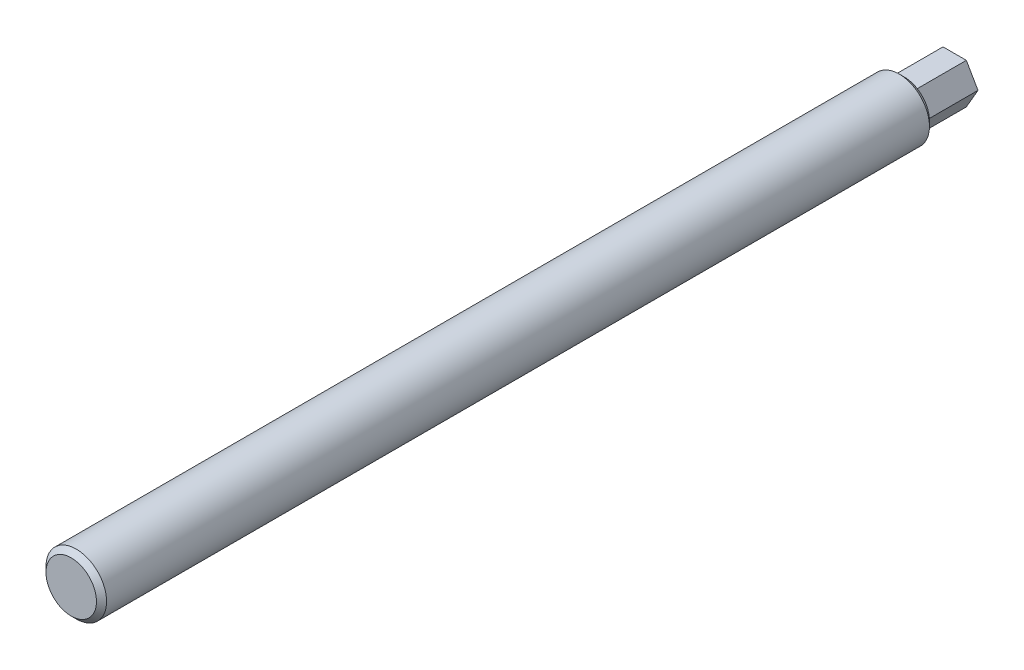
ISO-10303-21;
HEADER;
FILE_DESCRIPTION(('STEP AP214'),'2;1');
FILE_NAME('part.step','',(''),(''),'','','');
FILE_SCHEMA(('AUTOMOTIVE_DESIGN { 1 0 10303 214 1 1 1 1 }'));
ENDSEC;
DATA;
#1=APPLICATION_CONTEXT('core data for automotive mechanical design processes');
#2=APPLICATION_PROTOCOL_DEFINITION('international standard','automotive_design',2000,#1);
#3=PRODUCT_CONTEXT('',#1,'mechanical');
#4=PRODUCT('Part','Part','',(#3));
#5=PRODUCT_RELATED_PRODUCT_CATEGORY('part','',(#4));
#6=PRODUCT_DEFINITION_FORMATION('','',#4);
#7=PRODUCT_DEFINITION_CONTEXT('part definition',#1,'design');
#8=PRODUCT_DEFINITION('design','',#6,#7);
#9=PRODUCT_DEFINITION_SHAPE('','',#8);
#10=(LENGTH_UNIT() NAMED_UNIT(*) SI_UNIT(.MILLI.,.METRE.));
#11=(NAMED_UNIT(*) PLANE_ANGLE_UNIT() SI_UNIT($,.RADIAN.));
#12=(NAMED_UNIT(*) SI_UNIT($,.STERADIAN.) SOLID_ANGLE_UNIT());
#13=UNCERTAINTY_MEASURE_WITH_UNIT(LENGTH_MEASURE(1.E-05),#10,'distance_accuracy_value','');
#14=(GEOMETRIC_REPRESENTATION_CONTEXT(3) GLOBAL_UNCERTAINTY_ASSIGNED_CONTEXT((#13)) GLOBAL_UNIT_ASSIGNED_CONTEXT((#10,
#11,#12)) REPRESENTATION_CONTEXT('',''));
#15=CARTESIAN_POINT('',(0.,0.,0.));
#16=DIRECTION('',(0.,0.,1.));
#17=DIRECTION('',(1.,0.,0.));
#18=AXIS2_PLACEMENT_3D('',#15,#16,#17);
#19=CARTESIAN_POINT('',(0.,0.,-10.));
#20=DIRECTION('',(0.,0.,1.));
#21=DIRECTION('',(1.,0.,0.));
#22=AXIS2_PLACEMENT_3D('',#19,#20,#21);
#23=PLANE('',#22);
#24=DIRECTION('',(0.5,-0.866025403784438,0.));
#25=VECTOR('',#24,1.);
#26=CARTESIAN_POINT('',(-4.61880215351701,0.,-10.));
#27=LINE('',#26,#25);
#28=CARTESIAN_POINT('',(-4.61880215351701,0.,-10.));
#29=VERTEX_POINT('',#28);
#30=CARTESIAN_POINT('',(-2.3094010767585,-4.,-10.));
#31=VERTEX_POINT('',#30);
#32=EDGE_CURVE('E155',#29,#31,#27,.T.);
#33=ORIENTED_EDGE('',*,*,#32,.F.);
#34=DIRECTION('',(-0.5,-0.866025403784439,0.));
#35=VECTOR('',#34,1.);
#36=CARTESIAN_POINT('',(-2.3094010767585,4.,-10.));
#37=LINE('',#36,#35);
#38=CARTESIAN_POINT('',(-2.3094010767585,4.,-10.));
#39=VERTEX_POINT('',#38);
#40=EDGE_CURVE('E162',#39,#29,#37,.T.);
#41=ORIENTED_EDGE('',*,*,#40,.F.);
#42=DIRECTION('',(1.,0.,0.));
#43=VECTOR('',#42,1.);
#44=CARTESIAN_POINT('',(2.3094010767585,4.,-10.));
#45=LINE('',#44,#43);
#46=CARTESIAN_POINT('',(2.3094010767585,4.,-10.));
#47=VERTEX_POINT('',#46);
#48=EDGE_CURVE('E169',#47,#39,#45,.F.);
#49=ORIENTED_EDGE('',*,*,#48,.F.);
#50=DIRECTION('',(-0.5,0.866025403784439,0.));
#51=VECTOR('',#50,1.);
#52=CARTESIAN_POINT('',(4.618802153517,0.,-10.));
#53=LINE('',#52,#51);
#54=CARTESIAN_POINT('',(4.618802153517,0.,-10.));
#55=VERTEX_POINT('',#54);
#56=EDGE_CURVE('E81',#55,#47,#53,.T.);
#57=ORIENTED_EDGE('',*,*,#56,.F.);
#58=DIRECTION('',(0.5,0.866025403784439,0.));
#59=VECTOR('',#58,1.);
#60=CARTESIAN_POINT('',(2.3094010767585,-4.,-10.));
#61=LINE('',#60,#59);
#62=CARTESIAN_POINT('',(2.3094010767585,-4.,-10.));
#63=VERTEX_POINT('',#62);
#64=EDGE_CURVE('E84',#63,#55,#61,.T.);
#65=ORIENTED_EDGE('',*,*,#64,.F.);
#66=DIRECTION('',(1.,0.,0.));
#67=VECTOR('',#66,1.);
#68=CARTESIAN_POINT('',(-2.3094010767585,-4.,-10.));
#69=LINE('',#68,#67);
#70=EDGE_CURVE('E86',#31,#63,#69,.T.);
#71=ORIENTED_EDGE('',*,*,#70,.F.);
#72=EDGE_LOOP('',(#33,#41,#49,#57,#65,#71));
#73=FACE_BOUND('',#72,.T.);
#74=ADVANCED_FACE('F17',(#73),#23,.F.);
#75=CARTESIAN_POINT('',(-2.3094010767585,-4.,0.));
#76=DIRECTION('',(0.,-1.,0.));
#77=DIRECTION('',(0.,0.,-1.));
#78=AXIS2_PLACEMENT_3D('',#75,#76,#77);
#79=PLANE('',#78);
#80=DIRECTION('',(-1.,0.,0.));
#81=VECTOR('',#80,1.);
#82=CARTESIAN_POINT('',(0.,-4.,0.));
#83=LINE('',#82,#81);
#84=CARTESIAN_POINT('',(-2.3094010767585,-4.,0.));
#85=VERTEX_POINT('',#84);
#86=CARTESIAN_POINT('',(2.3094010767585,-4.,0.));
#87=VERTEX_POINT('',#86);
#88=EDGE_CURVE('E150',#85,#87,#83,.F.);
#89=ORIENTED_EDGE('',*,*,#88,.F.);
#90=DIRECTION('',(0.,0.,1.));
#91=VECTOR('',#90,1.);
#92=CARTESIAN_POINT('',(-2.3094010767585,-4.,0.));
#93=LINE('',#92,#91);
#94=EDGE_CURVE('E98',#31,#85,#93,.T.);
#95=ORIENTED_EDGE('',*,*,#94,.F.);
#96=ORIENTED_EDGE('',*,*,#70,.T.);
#97=DIRECTION('',(0.,0.,1.));
#98=VECTOR('',#97,1.);
#99=CARTESIAN_POINT('',(2.3094010767585,-4.,0.));
#100=LINE('',#99,#98);
#101=EDGE_CURVE('E92',#87,#63,#100,.F.);
#102=ORIENTED_EDGE('',*,*,#101,.F.);
#103=EDGE_LOOP('',(#89,#95,#96,#102));
#104=FACE_BOUND('',#103,.T.);
#105=ADVANCED_FACE('F95',(#104),#79,.T.);
#106=CARTESIAN_POINT('',(2.3094010767585,-4.,0.));
#107=DIRECTION('',(0.866025403784439,-0.5,0.));
#108=DIRECTION('',(0.5,0.866025403784439,0.));
#109=AXIS2_PLACEMENT_3D('',#106,#107,#108);
#110=PLANE('',#109);
#111=DIRECTION('',(0.5,0.866025403784439,0.));
#112=VECTOR('',#111,1.);
#113=CARTESIAN_POINT('',(2.3094010767585,-4.,0.));
#114=LINE('',#113,#112);
#115=CARTESIAN_POINT('',(4.618802153517,0.,0.));
#116=VERTEX_POINT('',#115);
#117=EDGE_CURVE('E104',#87,#116,#114,.T.);
#118=ORIENTED_EDGE('',*,*,#117,.F.);
#119=ORIENTED_EDGE('',*,*,#101,.T.);
#120=ORIENTED_EDGE('',*,*,#64,.T.);
#121=DIRECTION('',(0.,0.,1.));
#122=VECTOR('',#121,1.);
#123=CARTESIAN_POINT('',(4.618802153517,0.,0.));
#124=LINE('',#123,#122);
#125=EDGE_CURVE('E111',#116,#55,#124,.F.);
#126=ORIENTED_EDGE('',*,*,#125,.F.);
#127=EDGE_LOOP('',(#118,#119,#120,#126));
#128=FACE_BOUND('',#127,.T.);
#129=ADVANCED_FACE('F102',(#128),#110,.T.);
#130=CARTESIAN_POINT('',(4.618802153517,0.,0.));
#131=DIRECTION('',(0.866025403784439,0.5,0.));
#132=DIRECTION('',(-0.5,0.866025403784439,0.));
#133=AXIS2_PLACEMENT_3D('',#130,#131,#132);
#134=PLANE('',#133);
#135=DIRECTION('',(-0.5,0.866025403784439,0.));
#136=VECTOR('',#135,1.);
#137=CARTESIAN_POINT('',(4.618802153517,0.,0.));
#138=LINE('',#137,#136);
#139=CARTESIAN_POINT('',(2.3094010767585,4.,0.));
#140=VERTEX_POINT('',#139);
#141=EDGE_CURVE('E145',#116,#140,#138,.T.);
#142=ORIENTED_EDGE('',*,*,#141,.F.);
#143=ORIENTED_EDGE('',*,*,#125,.T.);
#144=ORIENTED_EDGE('',*,*,#56,.T.);
#145=DIRECTION('',(0.,0.,1.));
#146=VECTOR('',#145,1.);
#147=CARTESIAN_POINT('',(2.3094010767585,4.,0.));
#148=LINE('',#147,#146);
#149=EDGE_CURVE('E165',#140,#47,#148,.F.);
#150=ORIENTED_EDGE('',*,*,#149,.F.);
#151=EDGE_LOOP('',(#142,#143,#144,#150));
#152=FACE_BOUND('',#151,.T.);
#153=ADVANCED_FACE('F174',(#152),#134,.T.);
#154=CARTESIAN_POINT('',(2.3094010767585,4.,0.));
#155=DIRECTION('',(0.,1.,0.));
#156=DIRECTION('',(0.,0.,1.));
#157=AXIS2_PLACEMENT_3D('',#154,#155,#156);
#158=PLANE('',#157);
#159=DIRECTION('',(-1.,0.,0.));
#160=VECTOR('',#159,1.);
#161=CARTESIAN_POINT('',(0.,4.,0.));
#162=LINE('',#161,#160);
#163=CARTESIAN_POINT('',(-2.3094010767585,4.,0.));
#164=VERTEX_POINT('',#163);
#165=EDGE_CURVE('E137',#140,#164,#162,.T.);
#166=ORIENTED_EDGE('',*,*,#165,.F.);
#167=ORIENTED_EDGE('',*,*,#149,.T.);
#168=ORIENTED_EDGE('',*,*,#48,.T.);
#169=DIRECTION('',(0.,0.,1.));
#170=VECTOR('',#169,1.);
#171=CARTESIAN_POINT('',(-2.3094010767585,4.,0.));
#172=LINE('',#171,#170);
#173=EDGE_CURVE('E158',#164,#39,#172,.F.);
#174=ORIENTED_EDGE('',*,*,#173,.F.);
#175=EDGE_LOOP('',(#166,#167,#168,#174));
#176=FACE_BOUND('',#175,.T.);
#177=ADVANCED_FACE('F182',(#176),#158,.T.);
#178=CARTESIAN_POINT('',(-2.3094010767585,4.,0.));
#179=DIRECTION('',(-0.866025403784439,0.5,0.));
#180=DIRECTION('',(-0.5,-0.866025403784439,0.));
#181=AXIS2_PLACEMENT_3D('',#178,#179,#180);
#182=PLANE('',#181);
#183=DIRECTION('',(-0.5,-0.866025403784439,0.));
#184=VECTOR('',#183,1.);
#185=CARTESIAN_POINT('',(-2.3094010767585,4.,0.));
#186=LINE('',#185,#184);
#187=CARTESIAN_POINT('',(-4.61880215351701,0.,0.));
#188=VERTEX_POINT('',#187);
#189=EDGE_CURVE('E130',#164,#188,#186,.T.);
#190=ORIENTED_EDGE('',*,*,#189,.F.);
#191=ORIENTED_EDGE('',*,*,#173,.T.);
#192=ORIENTED_EDGE('',*,*,#40,.T.);
#193=DIRECTION('',(0.,0.,1.));
#194=VECTOR('',#193,1.);
#195=CARTESIAN_POINT('',(-4.61880215351701,0.,0.));
#196=LINE('',#195,#194);
#197=EDGE_CURVE('E40',#188,#29,#196,.F.);
#198=ORIENTED_EDGE('',*,*,#197,.F.);
#199=EDGE_LOOP('',(#190,#191,#192,#198));
#200=FACE_BOUND('',#199,.T.);
#201=ADVANCED_FACE('F180',(#200),#182,.T.);
#202=CARTESIAN_POINT('',(-4.61880215351701,0.,0.));
#203=DIRECTION('',(-0.866025403784438,-0.5,0.));
#204=DIRECTION('',(0.5,-0.866025403784438,0.));
#205=AXIS2_PLACEMENT_3D('',#202,#203,#204);
#206=PLANE('',#205);
#207=DIRECTION('',(0.500000000000001,-0.866025403784438,0.));
#208=VECTOR('',#207,1.);
#209=CARTESIAN_POINT('',(-4.61880215351701,0.,0.));
#210=LINE('',#209,#208);
#211=EDGE_CURVE('E124',#188,#85,#210,.T.);
#212=ORIENTED_EDGE('',*,*,#211,.F.);
#213=ORIENTED_EDGE('',*,*,#197,.T.);
#214=ORIENTED_EDGE('',*,*,#32,.T.);
#215=ORIENTED_EDGE('',*,*,#94,.T.);
#216=EDGE_LOOP('',(#212,#213,#214,#215));
#217=FACE_BOUND('',#216,.T.);
#218=ADVANCED_FACE('F179',(#217),#206,.T.);
#219=CARTESIAN_POINT('',(0.,0.,0.));
#220=DIRECTION('',(0.,0.,-1.));
#221=DIRECTION('',(-1.,0.,0.));
#222=AXIS2_PLACEMENT_3D('',#219,#220,#221);
#223=PLANE('',#222);
#224=ORIENTED_EDGE('',*,*,#189,.T.);
#225=ORIENTED_EDGE('',*,*,#211,.T.);
#226=ORIENTED_EDGE('',*,*,#88,.T.);
#227=ORIENTED_EDGE('',*,*,#117,.T.);
#228=ORIENTED_EDGE('',*,*,#141,.T.);
#229=ORIENTED_EDGE('',*,*,#165,.T.);
#230=EDGE_LOOP('',(#224,#225,#226,#227,#228,#229));
#231=FACE_BOUND('',#230,.T.);
#232=CARTESIAN_POINT('',(0.,0.,-3.97903932025656E-10));
#233=DIRECTION('',(0.,0.,1.));
#234=DIRECTION('',(1.,0.,0.));
#235=AXIS2_PLACEMENT_3D('',#232,#233,#234);
#236=CIRCLE('',#235,5.0000000004502);
#237=CARTESIAN_POINT('',(5.0000000004502,0.,-3.97903932025656E-10));
#238=VERTEX_POINT('',#237);
#239=EDGE_CURVE('E20',#238,#238,#236,.T.);
#240=ORIENTED_EDGE('',*,*,#239,.F.);
#241=EDGE_LOOP('',(#240));
#242=FACE_BOUND('',#241,.T.);
#243=ADVANCED_FACE('F176',(#231,#242),#223,.T.);
#244=CARTESIAN_POINT('',(0.,0.,165.));
#245=DIRECTION('',(0.,0.,-1.));
#246=DIRECTION('',(-1.,0.,0.));
#247=AXIS2_PLACEMENT_3D('',#244,#245,#246);
#248=PLANE('',#247);
#249=CARTESIAN_POINT('',(0.,0.,165.000000000418));
#250=DIRECTION('',(0.,0.,-1.));
#251=DIRECTION('',(-1.,0.,0.));
#252=AXIS2_PLACEMENT_3D('',#249,#250,#251);
#253=CIRCLE('',#252,5.00000000050704);
#254=CARTESIAN_POINT('',(-5.00000000050704,0.,165.000000000418));
#255=VERTEX_POINT('',#254);
#256=EDGE_CURVE('E114',#255,#255,#253,.T.);
#257=ORIENTED_EDGE('',*,*,#256,.F.);
#258=EDGE_LOOP('',(#257));
#259=FACE_BOUND('',#258,.T.);
#260=ADVANCED_FACE('F207',(#259),#248,.F.);
#261=CARTESIAN_POINT('',(0.,0.,1.0000000004311));
#262=DIRECTION('',(0.,0.,1.));
#263=DIRECTION('',(1.,0.,0.));
#264=AXIS2_PLACEMENT_3D('',#261,#262,#263);
#265=CONICAL_SURFACE('',#264,5.99999999951706,0.785398162516375);
#266=ORIENTED_EDGE('',*,*,#239,.T.);
#267=EDGE_LOOP('',(#266));
#268=FACE_BOUND('',#267,.T.);
#269=CARTESIAN_POINT('',(0.,0.,1.));
#270=DIRECTION('',(0.,0.,1.));
#271=DIRECTION('',(1.,0.,0.));
#272=AXIS2_PLACEMENT_3D('',#269,#270,#271);
#273=CIRCLE('',#272,6.);
#274=CARTESIAN_POINT('',(6.,0.,1.));
#275=VERTEX_POINT('',#274);
#276=EDGE_CURVE('E27',#275,#275,#273,.T.);
#277=ORIENTED_EDGE('',*,*,#276,.F.);
#278=EDGE_LOOP('',(#277));
#279=FACE_BOUND('',#278,.T.);
#280=ADVANCED_FACE('F200',(#268,#279),#265,.T.);
#281=CARTESIAN_POINT('',(0.,0.,163.999999999589));
#282=DIRECTION('',(0.,0.,-1.));
#283=DIRECTION('',(-1.,0.,0.));
#284=AXIS2_PLACEMENT_3D('',#281,#282,#283);
#285=CONICAL_SURFACE('',#284,5.99999999946021,0.785398162459532);
#286=CARTESIAN_POINT('',(0.,0.,164.));
#287=DIRECTION('',(0.,0.,1.));
#288=DIRECTION('',(1.,0.,0.));
#289=AXIS2_PLACEMENT_3D('',#286,#287,#288);
#290=CIRCLE('',#289,6.);
#291=CARTESIAN_POINT('',(6.,0.,164.));
#292=VERTEX_POINT('',#291);
#293=EDGE_CURVE('E11',#292,#292,#290,.F.);
#294=ORIENTED_EDGE('',*,*,#293,.F.);
#295=EDGE_LOOP('',(#294));
#296=FACE_BOUND('',#295,.T.);
#297=ORIENTED_EDGE('',*,*,#256,.T.);
#298=EDGE_LOOP('',(#297));
#299=FACE_BOUND('',#298,.T.);
#300=ADVANCED_FACE('F194',(#296,#299),#285,.T.);
#301=CARTESIAN_POINT('',(0.,0.,0.));
#302=DIRECTION('',(0.,0.,1.));
#303=DIRECTION('',(1.,0.,0.));
#304=AXIS2_PLACEMENT_3D('',#301,#302,#303);
#305=CYLINDRICAL_SURFACE('',#304,6.);
#306=ORIENTED_EDGE('',*,*,#293,.T.);
#307=EDGE_LOOP('',(#306));
#308=FACE_BOUND('',#307,.T.);
#309=ORIENTED_EDGE('',*,*,#276,.T.);
#310=EDGE_LOOP('',(#309));
#311=FACE_BOUND('',#310,.T.);
#312=ADVANCED_FACE('F192',(#308,#311),#305,.T.);
#313=CLOSED_SHELL('',(#74,#105,#129,#153,#177,#201,#218,#243,#260,#280,#300,#312));
#314=MANIFOLD_SOLID_BREP('B1',#313);
#315=ADVANCED_BREP_SHAPE_REPRESENTATION('',(#18,#314),#14);
#316=SHAPE_DEFINITION_REPRESENTATION(#9,#315);
ENDSEC;
END-ISO-10303-21;
